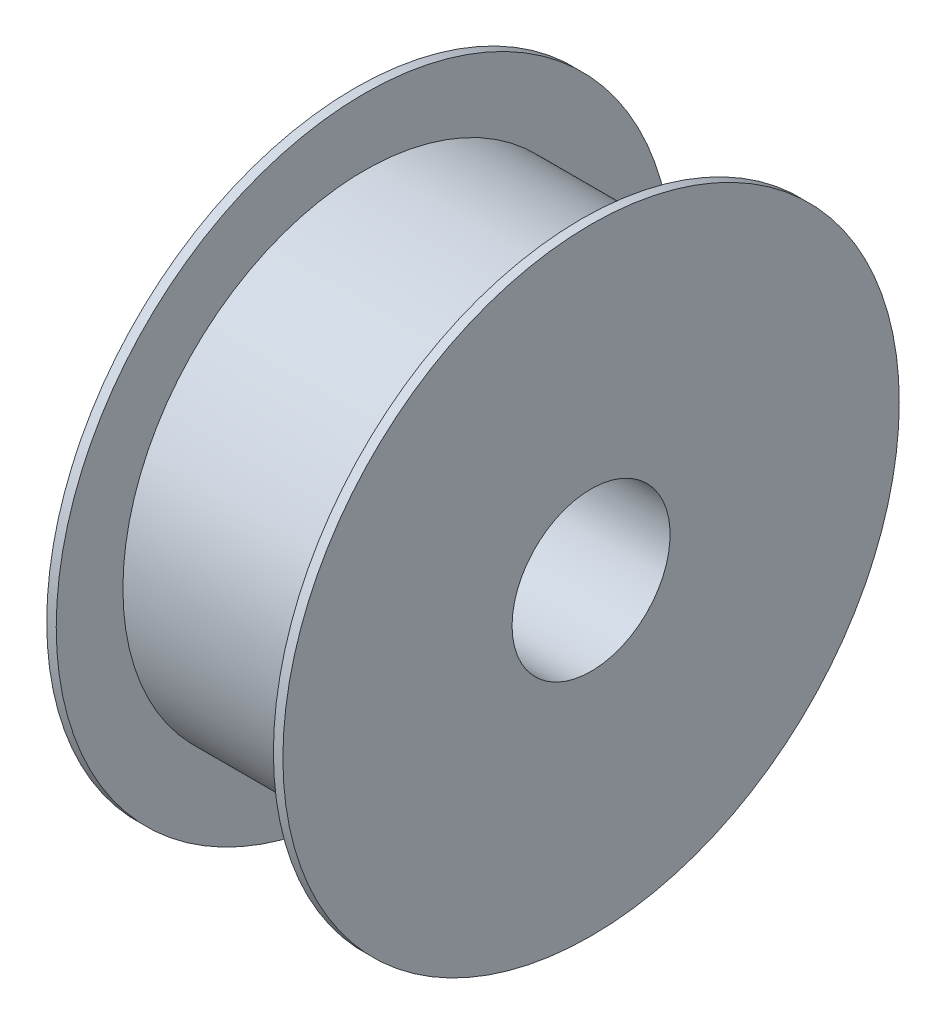
ISO-10303-21;
HEADER;
FILE_DESCRIPTION(('STEP AP214'),'2;1');
FILE_NAME('part.step','',(''),(''),'','','');
FILE_SCHEMA(('AUTOMOTIVE_DESIGN { 1 0 10303 214 1 1 1 1 }'));
ENDSEC;
DATA;
#1=APPLICATION_CONTEXT('core data for automotive mechanical design processes');
#2=APPLICATION_PROTOCOL_DEFINITION('international standard','automotive_design',2000,#1);
#3=PRODUCT_CONTEXT('',#1,'mechanical');
#4=PRODUCT('Part','Part','',(#3));
#5=PRODUCT_RELATED_PRODUCT_CATEGORY('part','',(#4));
#6=PRODUCT_DEFINITION_FORMATION('','',#4);
#7=PRODUCT_DEFINITION_CONTEXT('part definition',#1,'design');
#8=PRODUCT_DEFINITION('design','',#6,#7);
#9=PRODUCT_DEFINITION_SHAPE('','',#8);
#10=(LENGTH_UNIT() NAMED_UNIT(*) SI_UNIT(.MILLI.,.METRE.));
#11=(NAMED_UNIT(*) PLANE_ANGLE_UNIT() SI_UNIT($,.RADIAN.));
#12=(NAMED_UNIT(*) SI_UNIT($,.STERADIAN.) SOLID_ANGLE_UNIT());
#13=UNCERTAINTY_MEASURE_WITH_UNIT(LENGTH_MEASURE(1.E-05),#10,'distance_accuracy_value','');
#14=(GEOMETRIC_REPRESENTATION_CONTEXT(3) GLOBAL_UNCERTAINTY_ASSIGNED_CONTEXT((#13)) GLOBAL_UNIT_ASSIGNED_CONTEXT((#10,
#11,#12)) REPRESENTATION_CONTEXT('',''));
#15=CARTESIAN_POINT('',(0.,0.,0.));
#16=DIRECTION('',(0.,0.,1.));
#17=DIRECTION('',(1.,0.,0.));
#18=AXIS2_PLACEMENT_3D('',#15,#16,#17);
#19=CARTESIAN_POINT('',(-2.32735630179795,0.,-33.7830387952373));
#20=DIRECTION('',(-1.,0.,0.));
#21=DIRECTION('',(0.,0.,1.));
#22=AXIS2_PLACEMENT_3D('',#19,#20,#21);
#23=CYLINDRICAL_SURFACE('',#22,97.5);
#24=CARTESIAN_POINT('',(0.,0.,-33.7830387952373));
#25=DIRECTION('',(-1.,0.,0.));
#26=DIRECTION('',(0.,0.,1.));
#27=AXIS2_PLACEMENT_3D('',#24,#25,#26);
#28=CIRCLE('',#27,97.5);
#29=CARTESIAN_POINT('',(0.,0.,63.7169612047627));
#30=VERTEX_POINT('',#29);
#31=EDGE_CURVE('E59',#30,#30,#28,.T.);
#32=ORIENTED_EDGE('',*,*,#31,.F.);
#33=EDGE_LOOP('',(#32));
#34=FACE_BOUND('',#33,.T.);
#35=CARTESIAN_POINT('',(3.,0.,-33.7830387952373));
#36=DIRECTION('',(-1.,0.,0.));
#37=DIRECTION('',(0.,0.,1.));
#38=AXIS2_PLACEMENT_3D('',#35,#36,#37);
#39=CIRCLE('',#38,97.5);
#40=CARTESIAN_POINT('',(3.,0.,63.7169612047627));
#41=VERTEX_POINT('',#40);
#42=EDGE_CURVE('E10',#41,#41,#39,.T.);
#43=ORIENTED_EDGE('',*,*,#42,.T.);
#44=EDGE_LOOP('',(#43));
#45=FACE_BOUND('',#44,.T.);
#46=ADVANCED_FACE('F31',(#34,#45),#23,.T.);
#47=CARTESIAN_POINT('',(3.,0.,-131.283038795237));
#48=DIRECTION('',(-1.,0.,0.));
#49=DIRECTION('',(0.,0.,1.));
#50=AXIS2_PLACEMENT_3D('',#47,#48,#49);
#51=PLANE('',#50);
#52=ORIENTED_EDGE('',*,*,#42,.F.);
#53=EDGE_LOOP('',(#52));
#54=FACE_BOUND('',#53,.T.);
#55=CARTESIAN_POINT('',(3.,0.,-33.7830387952373));
#56=DIRECTION('',(-1.,0.,0.));
#57=DIRECTION('',(0.,0.,1.));
#58=AXIS2_PLACEMENT_3D('',#55,#56,#57);
#59=CIRCLE('',#58,76.4060254615636);
#60=CARTESIAN_POINT('',(3.,0.,42.6229866663263));
#61=VERTEX_POINT('',#60);
#62=EDGE_CURVE('E37',#61,#61,#59,.T.);
#63=ORIENTED_EDGE('',*,*,#62,.T.);
#64=EDGE_LOOP('',(#63));
#65=FACE_BOUND('',#64,.T.);
#66=ADVANCED_FACE('F66',(#54,#65),#51,.F.);
#67=CARTESIAN_POINT('',(-2.32735630179795,0.,-33.7830387952373));
#68=DIRECTION('',(-1.,0.,0.));
#69=DIRECTION('',(0.,0.,1.));
#70=AXIS2_PLACEMENT_3D('',#67,#68,#69);
#71=CYLINDRICAL_SURFACE('',#70,76.4060254615636);
#72=ORIENTED_EDGE('',*,*,#62,.F.);
#73=EDGE_LOOP('',(#72));
#74=FACE_BOUND('',#73,.T.);
#75=CARTESIAN_POINT('',(71.7075484586744,0.,-33.7830387952373));
#76=DIRECTION('',(-1.,0.,0.));
#77=DIRECTION('',(0.,0.,1.));
#78=AXIS2_PLACEMENT_3D('',#75,#76,#77);
#79=CIRCLE('',#78,76.4060254615636);
#80=CARTESIAN_POINT('',(71.7075484586744,0.,42.6229866663263));
#81=VERTEX_POINT('',#80);
#82=EDGE_CURVE('E41',#81,#81,#79,.T.);
#83=ORIENTED_EDGE('',*,*,#82,.T.);
#84=EDGE_LOOP('',(#83));
#85=FACE_BOUND('',#84,.T.);
#86=ADVANCED_FACE('F70',(#74,#85),#71,.T.);
#87=CARTESIAN_POINT('',(71.7075484586744,0.,-110.189064256801));
#88=DIRECTION('',(1.,0.,0.));
#89=DIRECTION('',(0.,0.,-1.));
#90=AXIS2_PLACEMENT_3D('',#87,#88,#89);
#91=PLANE('',#90);
#92=ORIENTED_EDGE('',*,*,#82,.F.);
#93=EDGE_LOOP('',(#92));
#94=FACE_BOUND('',#93,.T.);
#95=CARTESIAN_POINT('',(71.7075484586744,0.,-33.7830387952373));
#96=DIRECTION('',(-1.,0.,0.));
#97=DIRECTION('',(0.,0.,1.));
#98=AXIS2_PLACEMENT_3D('',#95,#96,#97);
#99=CIRCLE('',#98,97.5);
#100=CARTESIAN_POINT('',(71.7075484586744,0.,63.7169612047627));
#101=VERTEX_POINT('',#100);
#102=EDGE_CURVE('E45',#101,#101,#99,.T.);
#103=ORIENTED_EDGE('',*,*,#102,.T.);
#104=EDGE_LOOP('',(#103));
#105=FACE_BOUND('',#104,.T.);
#106=ADVANCED_FACE('F75',(#94,#105),#91,.F.);
#107=CARTESIAN_POINT('',(-2.32735630179795,0.,-33.7830387952373));
#108=DIRECTION('',(-1.,0.,0.));
#109=DIRECTION('',(0.,0.,1.));
#110=AXIS2_PLACEMENT_3D('',#107,#108,#109);
#111=CYLINDRICAL_SURFACE('',#110,97.5);
#112=ORIENTED_EDGE('',*,*,#102,.F.);
#113=EDGE_LOOP('',(#112));
#114=FACE_BOUND('',#113,.T.);
#115=CARTESIAN_POINT('',(74.7075484586744,0.,-33.7830387952373));
#116=DIRECTION('',(-1.,0.,0.));
#117=DIRECTION('',(0.,0.,1.));
#118=AXIS2_PLACEMENT_3D('',#115,#116,#117);
#119=CIRCLE('',#118,97.5);
#120=CARTESIAN_POINT('',(74.7075484586744,0.,63.7169612047627));
#121=VERTEX_POINT('',#120);
#122=EDGE_CURVE('E50',#121,#121,#119,.T.);
#123=ORIENTED_EDGE('',*,*,#122,.T.);
#124=EDGE_LOOP('',(#123));
#125=FACE_BOUND('',#124,.T.);
#126=ADVANCED_FACE('F81',(#114,#125),#111,.T.);
#127=CARTESIAN_POINT('',(74.7075484586744,0.,-131.283038795237));
#128=DIRECTION('',(-1.,0.,0.));
#129=DIRECTION('',(0.,0.,1.));
#130=AXIS2_PLACEMENT_3D('',#127,#128,#129);
#131=PLANE('',#130);
#132=ORIENTED_EDGE('',*,*,#122,.F.);
#133=EDGE_LOOP('',(#132));
#134=FACE_BOUND('',#133,.T.);
#135=CARTESIAN_POINT('',(74.7075484586745,0.,-33.7830387952373));
#136=DIRECTION('',(-1.,0.,0.));
#137=DIRECTION('',(0.,0.,1.));
#138=AXIS2_PLACEMENT_3D('',#135,#136,#137);
#139=CIRCLE('',#138,25.);
#140=CARTESIAN_POINT('',(74.7075484586745,0.,-8.78303879523729));
#141=VERTEX_POINT('',#140);
#142=EDGE_CURVE('E53',#141,#141,#139,.T.);
#143=ORIENTED_EDGE('',*,*,#142,.T.);
#144=EDGE_LOOP('',(#143));
#145=FACE_BOUND('',#144,.T.);
#146=ADVANCED_FACE('F85',(#134,#145),#131,.F.);
#147=CARTESIAN_POINT('',(-2.32735630179795,0.,-33.7830387952373));
#148=DIRECTION('',(-1.,0.,0.));
#149=DIRECTION('',(0.,0.,1.));
#150=AXIS2_PLACEMENT_3D('',#147,#148,#149);
#151=CYLINDRICAL_SURFACE('',#150,25.);
#152=ORIENTED_EDGE('',*,*,#142,.F.);
#153=EDGE_LOOP('',(#152));
#154=FACE_BOUND('',#153,.T.);
#155=CARTESIAN_POINT('',(0.,0.,-33.7830387952373));
#156=DIRECTION('',(-1.,0.,0.));
#157=DIRECTION('',(0.,0.,1.));
#158=AXIS2_PLACEMENT_3D('',#155,#156,#157);
#159=CIRCLE('',#158,25.);
#160=CARTESIAN_POINT('',(0.,0.,-8.78303879523729));
#161=VERTEX_POINT('',#160);
#162=EDGE_CURVE('E56',#161,#161,#159,.T.);
#163=ORIENTED_EDGE('',*,*,#162,.T.);
#164=EDGE_LOOP('',(#163));
#165=FACE_BOUND('',#164,.T.);
#166=ADVANCED_FACE('F89',(#154,#165),#151,.F.);
#167=CARTESIAN_POINT('',(0.,0.,-58.7830387952373));
#168=DIRECTION('',(1.,0.,0.));
#169=DIRECTION('',(0.,0.,-1.));
#170=AXIS2_PLACEMENT_3D('',#167,#168,#169);
#171=PLANE('',#170);
#172=ORIENTED_EDGE('',*,*,#162,.F.);
#173=EDGE_LOOP('',(#172));
#174=FACE_BOUND('',#173,.T.);
#175=ORIENTED_EDGE('',*,*,#31,.T.);
#176=EDGE_LOOP('',(#175));
#177=FACE_BOUND('',#176,.T.);
#178=ADVANCED_FACE('F63',(#174,#177),#171,.F.);
#179=CLOSED_SHELL('',(#46,#66,#86,#106,#126,#146,#166,#178));
#180=MANIFOLD_SOLID_BREP('B2',#179);
#181=ADVANCED_BREP_SHAPE_REPRESENTATION('',(#18,#180),#14);
#182=SHAPE_DEFINITION_REPRESENTATION(#9,#181);
ENDSEC;
END-ISO-10303-21;
